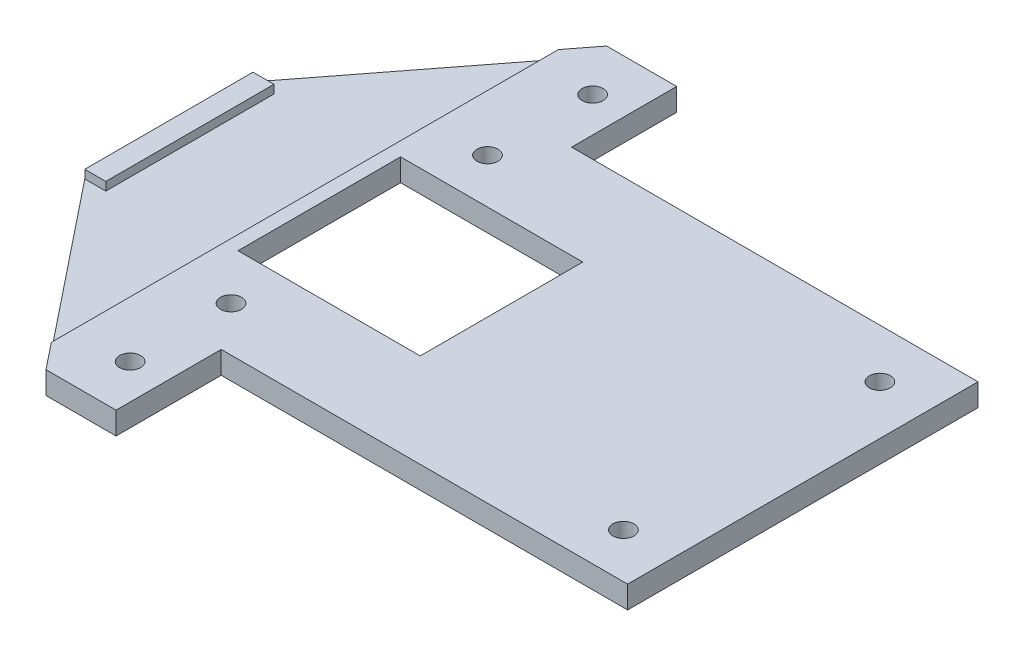
ISO-10303-21;
HEADER;
FILE_DESCRIPTION(('STEP AP214'),'2;1');
FILE_NAME('part.step','',(''),(''),'','','');
FILE_SCHEMA(('AUTOMOTIVE_DESIGN { 1 0 10303 214 1 1 1 1 }'));
ENDSEC;
DATA;
#1=APPLICATION_CONTEXT('core data for automotive mechanical design processes');
#2=APPLICATION_PROTOCOL_DEFINITION('international standard','automotive_design',2000,#1);
#3=PRODUCT_CONTEXT('',#1,'mechanical');
#4=PRODUCT('Part','Part','',(#3));
#5=PRODUCT_RELATED_PRODUCT_CATEGORY('part','',(#4));
#6=PRODUCT_DEFINITION_FORMATION('','',#4);
#7=PRODUCT_DEFINITION_CONTEXT('part definition',#1,'design');
#8=PRODUCT_DEFINITION('design','',#6,#7);
#9=PRODUCT_DEFINITION_SHAPE('','',#8);
#10=(LENGTH_UNIT() NAMED_UNIT(*) SI_UNIT(.MILLI.,.METRE.));
#11=(NAMED_UNIT(*) PLANE_ANGLE_UNIT() SI_UNIT($,.RADIAN.));
#12=(NAMED_UNIT(*) SI_UNIT($,.STERADIAN.) SOLID_ANGLE_UNIT());
#13=UNCERTAINTY_MEASURE_WITH_UNIT(LENGTH_MEASURE(1.E-05),#10,'distance_accuracy_value','');
#14=(GEOMETRIC_REPRESENTATION_CONTEXT(3) GLOBAL_UNCERTAINTY_ASSIGNED_CONTEXT((#13)) GLOBAL_UNIT_ASSIGNED_CONTEXT((#10,
#11,#12)) REPRESENTATION_CONTEXT('',''));
#15=CARTESIAN_POINT('',(0.,0.,0.));
#16=DIRECTION('',(0.,0.,1.));
#17=DIRECTION('',(1.,0.,0.));
#18=AXIS2_PLACEMENT_3D('',#15,#16,#17);
#19=CARTESIAN_POINT('',(11.,11.6,20.));
#20=DIRECTION('',(0.,0.,-1.));
#21=DIRECTION('',(-1.,0.,0.));
#22=AXIS2_PLACEMENT_3D('',#19,#20,#21);
#23=PLANE('',#22);
#24=DIRECTION('',(1.,0.,0.));
#25=VECTOR('',#24,1.);
#26=CARTESIAN_POINT('',(11.,1.6,20.));
#27=LINE('',#26,#25);
#28=CARTESIAN_POINT('',(11.,1.6,20.));
#29=VERTEX_POINT('',#28);
#30=CARTESIAN_POINT('',(16.,1.6,20.));
#31=VERTEX_POINT('',#30);
#32=EDGE_CURVE('E213',#29,#31,#27,.T.);
#33=ORIENTED_EDGE('',*,*,#32,.F.);
#34=DIRECTION('',(0.,-1.,0.));
#35=VECTOR('',#34,1.);
#36=CARTESIAN_POINT('',(11.,11.6,20.));
#37=LINE('',#36,#35);
#38=CARTESIAN_POINT('',(11.,0.,20.));
#39=VERTEX_POINT('',#38);
#40=EDGE_CURVE('E11',#29,#39,#37,.T.);
#41=ORIENTED_EDGE('',*,*,#40,.T.);
#42=DIRECTION('',(1.,0.,0.));
#43=VECTOR('',#42,1.);
#44=CARTESIAN_POINT('',(11.,0.,20.));
#45=LINE('',#44,#43);
#46=CARTESIAN_POINT('',(16.,0.,20.));
#47=VERTEX_POINT('',#46);
#48=EDGE_CURVE('E326',#39,#47,#45,.T.);
#49=ORIENTED_EDGE('',*,*,#48,.T.);
#50=DIRECTION('',(0.,-1.,0.));
#51=VECTOR('',#50,1.);
#52=CARTESIAN_POINT('',(16.,11.6,20.));
#53=LINE('',#52,#51);
#54=EDGE_CURVE('E294',#31,#47,#53,.T.);
#55=ORIENTED_EDGE('',*,*,#54,.F.);
#56=EDGE_LOOP('',(#33,#41,#49,#55));
#57=FACE_BOUND('',#56,.T.);
#58=ADVANCED_FACE('F34',(#57),#23,.F.);
#59=CARTESIAN_POINT('',(45.,11.6,20.));
#60=DIRECTION('',(-1.,0.,0.));
#61=DIRECTION('',(0.,0.,1.));
#62=AXIS2_PLACEMENT_3D('',#59,#60,#61);
#63=PLANE('',#62);
#64=DIRECTION('',(0.,0.,-1.));
#65=VECTOR('',#64,1.);
#66=CARTESIAN_POINT('',(45.,1.6,12.5));
#67=LINE('',#66,#65);
#68=CARTESIAN_POINT('',(45.,1.6,12.5));
#69=VERTEX_POINT('',#68);
#70=CARTESIAN_POINT('',(45.,1.6,-12.5));
#71=VERTEX_POINT('',#70);
#72=EDGE_CURVE('E58',#69,#71,#67,.T.);
#73=ORIENTED_EDGE('',*,*,#72,.F.);
#74=DIRECTION('',(0.,-1.,0.));
#75=VECTOR('',#74,1.);
#76=CARTESIAN_POINT('',(45.,11.6,12.5));
#77=LINE('',#76,#75);
#78=CARTESIAN_POINT('',(45.,0.,12.5));
#79=VERTEX_POINT('',#78);
#80=EDGE_CURVE('E297',#69,#79,#77,.T.);
#81=ORIENTED_EDGE('',*,*,#80,.T.);
#82=DIRECTION('',(0.,0.,-1.));
#83=VECTOR('',#82,1.);
#84=CARTESIAN_POINT('',(45.,0.,20.));
#85=LINE('',#84,#83);
#86=CARTESIAN_POINT('',(45.,0.,-12.5));
#87=VERTEX_POINT('',#86);
#88=EDGE_CURVE('E329',#79,#87,#85,.T.);
#89=ORIENTED_EDGE('',*,*,#88,.T.);
#90=DIRECTION('',(0.,-1.,0.));
#91=VECTOR('',#90,1.);
#92=CARTESIAN_POINT('',(45.,11.6,-12.5));
#93=LINE('',#92,#91);
#94=EDGE_CURVE('E285',#71,#87,#93,.T.);
#95=ORIENTED_EDGE('',*,*,#94,.F.);
#96=EDGE_LOOP('',(#73,#81,#89,#95));
#97=FACE_BOUND('',#96,.T.);
#98=ADVANCED_FACE('F383',(#97),#63,.F.);
#99=CARTESIAN_POINT('',(45.,11.6,-20.));
#100=DIRECTION('',(0.,0.,1.));
#101=DIRECTION('',(1.,0.,0.));
#102=AXIS2_PLACEMENT_3D('',#99,#100,#101);
#103=PLANE('',#102);
#104=DIRECTION('',(-1.,0.,0.));
#105=VECTOR('',#104,1.);
#106=CARTESIAN_POINT('',(16.,1.6,-20.));
#107=LINE('',#106,#105);
#108=CARTESIAN_POINT('',(16.,1.6,-20.));
#109=VERTEX_POINT('',#108);
#110=CARTESIAN_POINT('',(11.,1.6,-20.));
#111=VERTEX_POINT('',#110);
#112=EDGE_CURVE('E224',#109,#111,#107,.T.);
#113=ORIENTED_EDGE('',*,*,#112,.F.);
#114=DIRECTION('',(0.,-1.,0.));
#115=VECTOR('',#114,1.);
#116=CARTESIAN_POINT('',(16.,11.6,-20.));
#117=LINE('',#116,#115);
#118=CARTESIAN_POINT('',(16.,0.,-20.));
#119=VERTEX_POINT('',#118);
#120=EDGE_CURVE('E281',#109,#119,#117,.T.);
#121=ORIENTED_EDGE('',*,*,#120,.T.);
#122=DIRECTION('',(-1.,0.,0.));
#123=VECTOR('',#122,1.);
#124=CARTESIAN_POINT('',(45.,0.,-20.));
#125=LINE('',#124,#123);
#126=CARTESIAN_POINT('',(11.,0.,-20.));
#127=VERTEX_POINT('',#126);
#128=EDGE_CURVE('E332',#119,#127,#125,.T.);
#129=ORIENTED_EDGE('',*,*,#128,.T.);
#130=DIRECTION('',(0.,-1.,0.));
#131=VECTOR('',#130,1.);
#132=CARTESIAN_POINT('',(11.,11.6,-20.));
#133=LINE('',#132,#131);
#134=EDGE_CURVE('E43',#111,#127,#133,.T.);
#135=ORIENTED_EDGE('',*,*,#134,.F.);
#136=EDGE_LOOP('',(#113,#121,#129,#135));
#137=FACE_BOUND('',#136,.T.);
#138=ADVANCED_FACE('F357',(#137),#103,.F.);
#139=CARTESIAN_POINT('',(10.5,0.,-5.8));
#140=DIRECTION('',(-1.,0.,0.));
#141=DIRECTION('',(0.,0.,1.));
#142=AXIS2_PLACEMENT_3D('',#139,#140,#141);
#143=PLANE('',#142);
#144=DIRECTION('',(0.,0.,-1.));
#145=VECTOR('',#144,1.);
#146=CARTESIAN_POINT('',(10.5,1.6,-5.8));
#147=LINE('',#146,#145);
#148=CARTESIAN_POINT('',(10.5,1.6,5.8));
#149=VERTEX_POINT('',#148);
#150=CARTESIAN_POINT('',(10.5,1.6,-5.8));
#151=VERTEX_POINT('',#150);
#152=EDGE_CURVE('E246',#149,#151,#147,.T.);
#153=ORIENTED_EDGE('',*,*,#152,.F.);
#154=DIRECTION('',(0.,1.,0.));
#155=VECTOR('',#154,1.);
#156=CARTESIAN_POINT('',(10.5,0.,5.8));
#157=LINE('',#156,#155);
#158=CARTESIAN_POINT('',(10.5,0.,5.8));
#159=VERTEX_POINT('',#158);
#160=EDGE_CURVE('E311',#159,#149,#157,.T.);
#161=ORIENTED_EDGE('',*,*,#160,.F.);
#162=DIRECTION('',(0.,0.,1.));
#163=VECTOR('',#162,1.);
#164=CARTESIAN_POINT('',(10.5,0.,-5.8));
#165=LINE('',#164,#163);
#166=CARTESIAN_POINT('',(10.5,0.,-5.8));
#167=VERTEX_POINT('',#166);
#168=EDGE_CURVE('E296',#167,#159,#165,.T.);
#169=ORIENTED_EDGE('',*,*,#168,.F.);
#170=DIRECTION('',(0.,1.,0.));
#171=VECTOR('',#170,1.);
#172=CARTESIAN_POINT('',(10.5,0.,-5.8));
#173=LINE('',#172,#171);
#174=EDGE_CURVE('E312',#167,#151,#173,.T.);
#175=ORIENTED_EDGE('',*,*,#174,.T.);
#176=EDGE_LOOP('',(#153,#161,#169,#175));
#177=FACE_BOUND('',#176,.T.);
#178=ADVANCED_FACE('F421',(#177),#143,.F.);
#179=CARTESIAN_POINT('',(10.5,0.,-5.8));
#180=DIRECTION('',(0.,0.,-1.));
#181=DIRECTION('',(-1.,0.,0.));
#182=AXIS2_PLACEMENT_3D('',#179,#180,#181);
#183=PLANE('',#182);
#184=DIRECTION('',(1.,0.,0.));
#185=VECTOR('',#184,1.);
#186=CARTESIAN_POINT('',(10.5,1.6,-5.8));
#187=LINE('',#186,#185);
#188=CARTESIAN_POINT('',(23.5,1.6,-5.8));
#189=VERTEX_POINT('',#188);
#190=EDGE_CURVE('E244',#151,#189,#187,.T.);
#191=ORIENTED_EDGE('',*,*,#190,.F.);
#192=ORIENTED_EDGE('',*,*,#174,.F.);
#193=DIRECTION('',(-1.,0.,0.));
#194=VECTOR('',#193,1.);
#195=CARTESIAN_POINT('',(10.5,0.,-5.8));
#196=LINE('',#195,#194);
#197=CARTESIAN_POINT('',(23.5,0.,-5.8));
#198=VERTEX_POINT('',#197);
#199=EDGE_CURVE('E308',#198,#167,#196,.T.);
#200=ORIENTED_EDGE('',*,*,#199,.F.);
#201=DIRECTION('',(0.,1.,0.));
#202=VECTOR('',#201,1.);
#203=CARTESIAN_POINT('',(23.5,0.,-5.8));
#204=LINE('',#203,#202);
#205=EDGE_CURVE('E316',#198,#189,#204,.T.);
#206=ORIENTED_EDGE('',*,*,#205,.T.);
#207=EDGE_LOOP('',(#191,#192,#200,#206));
#208=FACE_BOUND('',#207,.T.);
#209=ADVANCED_FACE('F429',(#208),#183,.F.);
#210=CARTESIAN_POINT('',(23.5,0.,-5.8));
#211=DIRECTION('',(1.,0.,0.));
#212=DIRECTION('',(0.,0.,-1.));
#213=AXIS2_PLACEMENT_3D('',#210,#211,#212);
#214=PLANE('',#213);
#215=DIRECTION('',(0.,0.,1.));
#216=VECTOR('',#215,1.);
#217=CARTESIAN_POINT('',(23.5,1.6,-5.8));
#218=LINE('',#217,#216);
#219=CARTESIAN_POINT('',(23.5,1.6,5.8));
#220=VERTEX_POINT('',#219);
#221=EDGE_CURVE('E50',#189,#220,#218,.T.);
#222=ORIENTED_EDGE('',*,*,#221,.F.);
#223=ORIENTED_EDGE('',*,*,#205,.F.);
#224=DIRECTION('',(0.,0.,-1.));
#225=VECTOR('',#224,1.);
#226=CARTESIAN_POINT('',(23.5,0.,-5.8));
#227=LINE('',#226,#225);
#228=CARTESIAN_POINT('',(23.5,0.,5.8));
#229=VERTEX_POINT('',#228);
#230=EDGE_CURVE('E305',#229,#198,#227,.T.);
#231=ORIENTED_EDGE('',*,*,#230,.F.);
#232=DIRECTION('',(0.,1.,0.));
#233=VECTOR('',#232,1.);
#234=CARTESIAN_POINT('',(23.5,0.,5.8));
#235=LINE('',#234,#233);
#236=EDGE_CURVE('E319',#229,#220,#235,.T.);
#237=ORIENTED_EDGE('',*,*,#236,.T.);
#238=EDGE_LOOP('',(#222,#223,#231,#237));
#239=FACE_BOUND('',#238,.T.);
#240=ADVANCED_FACE('F435',(#239),#214,.F.);
#241=CARTESIAN_POINT('',(10.5,0.,5.8));
#242=DIRECTION('',(0.,0.,1.));
#243=DIRECTION('',(1.,0.,0.));
#244=AXIS2_PLACEMENT_3D('',#241,#242,#243);
#245=PLANE('',#244);
#246=DIRECTION('',(-1.,0.,0.));
#247=VECTOR('',#246,1.);
#248=CARTESIAN_POINT('',(10.5,1.6,5.8));
#249=LINE('',#248,#247);
#250=EDGE_CURVE('E241',#220,#149,#249,.T.);
#251=ORIENTED_EDGE('',*,*,#250,.F.);
#252=ORIENTED_EDGE('',*,*,#236,.F.);
#253=DIRECTION('',(1.,0.,0.));
#254=VECTOR('',#253,1.);
#255=CARTESIAN_POINT('',(10.5,0.,5.8));
#256=LINE('',#255,#254);
#257=EDGE_CURVE('E302',#159,#229,#256,.T.);
#258=ORIENTED_EDGE('',*,*,#257,.F.);
#259=ORIENTED_EDGE('',*,*,#160,.T.);
#260=EDGE_LOOP('',(#251,#252,#258,#259));
#261=FACE_BOUND('',#260,.T.);
#262=ADVANCED_FACE('F431',(#261),#245,.F.);
#263=CARTESIAN_POINT('',(16.,11.6,20.));
#264=DIRECTION('',(-1.,0.,0.));
#265=DIRECTION('',(0.,0.,1.));
#266=AXIS2_PLACEMENT_3D('',#263,#264,#265);
#267=PLANE('',#266);
#268=DIRECTION('',(0.,0.,-1.));
#269=VECTOR('',#268,1.);
#270=CARTESIAN_POINT('',(16.,1.6,20.));
#271=LINE('',#270,#269);
#272=CARTESIAN_POINT('',(16.,1.6,12.5));
#273=VERTEX_POINT('',#272);
#274=EDGE_CURVE('E215',#31,#273,#271,.T.);
#275=ORIENTED_EDGE('',*,*,#274,.F.);
#276=ORIENTED_EDGE('',*,*,#54,.T.);
#277=DIRECTION('',(0.,0.,-1.));
#278=VECTOR('',#277,1.);
#279=CARTESIAN_POINT('',(16.,0.,20.));
#280=LINE('',#279,#278);
#281=CARTESIAN_POINT('',(16.,0.,12.5));
#282=VERTEX_POINT('',#281);
#283=EDGE_CURVE('E284',#47,#282,#280,.T.);
#284=ORIENTED_EDGE('',*,*,#283,.T.);
#285=DIRECTION('',(0.,-1.,0.));
#286=VECTOR('',#285,1.);
#287=CARTESIAN_POINT('',(16.,11.6,12.5));
#288=LINE('',#287,#286);
#289=EDGE_CURVE('E293',#273,#282,#288,.T.);
#290=ORIENTED_EDGE('',*,*,#289,.F.);
#291=EDGE_LOOP('',(#275,#276,#284,#290));
#292=FACE_BOUND('',#291,.T.);
#293=ADVANCED_FACE('F434',(#292),#267,.F.);
#294=CARTESIAN_POINT('',(16.,11.6,12.5));
#295=DIRECTION('',(0.,0.,-1.));
#296=DIRECTION('',(-1.,0.,0.));
#297=AXIS2_PLACEMENT_3D('',#294,#295,#296);
#298=PLANE('',#297);
#299=DIRECTION('',(1.,0.,0.));
#300=VECTOR('',#299,1.);
#301=CARTESIAN_POINT('',(16.,1.6,12.5));
#302=LINE('',#301,#300);
#303=EDGE_CURVE('E217',#273,#69,#302,.T.);
#304=ORIENTED_EDGE('',*,*,#303,.F.);
#305=ORIENTED_EDGE('',*,*,#289,.T.);
#306=DIRECTION('',(1.,0.,0.));
#307=VECTOR('',#306,1.);
#308=CARTESIAN_POINT('',(16.,0.,12.5));
#309=LINE('',#308,#307);
#310=EDGE_CURVE('E290',#282,#79,#309,.T.);
#311=ORIENTED_EDGE('',*,*,#310,.T.);
#312=ORIENTED_EDGE('',*,*,#80,.F.);
#313=EDGE_LOOP('',(#304,#305,#311,#312));
#314=FACE_BOUND('',#313,.T.);
#315=ADVANCED_FACE('F387',(#314),#298,.F.);
#316=CARTESIAN_POINT('',(16.,11.6,-20.));
#317=DIRECTION('',(-1.,0.,0.));
#318=DIRECTION('',(0.,0.,1.));
#319=AXIS2_PLACEMENT_3D('',#316,#317,#318);
#320=PLANE('',#319);
#321=DIRECTION('',(0.,0.,-1.));
#322=VECTOR('',#321,1.);
#323=CARTESIAN_POINT('',(16.,1.6,-12.5));
#324=LINE('',#323,#322);
#325=CARTESIAN_POINT('',(16.,1.6,-12.5));
#326=VERTEX_POINT('',#325);
#327=EDGE_CURVE('E222',#326,#109,#324,.T.);
#328=ORIENTED_EDGE('',*,*,#327,.F.);
#329=DIRECTION('',(0.,-1.,0.));
#330=VECTOR('',#329,1.);
#331=CARTESIAN_POINT('',(16.,11.6,-12.5));
#332=LINE('',#331,#330);
#333=CARTESIAN_POINT('',(16.,0.,-12.5));
#334=VERTEX_POINT('',#333);
#335=EDGE_CURVE('E282',#326,#334,#332,.T.);
#336=ORIENTED_EDGE('',*,*,#335,.T.);
#337=DIRECTION('',(0.,0.,-1.));
#338=VECTOR('',#337,1.);
#339=CARTESIAN_POINT('',(16.,0.,-20.));
#340=LINE('',#339,#338);
#341=EDGE_CURVE('E275',#334,#119,#340,.T.);
#342=ORIENTED_EDGE('',*,*,#341,.T.);
#343=ORIENTED_EDGE('',*,*,#120,.F.);
#344=EDGE_LOOP('',(#328,#336,#342,#343));
#345=FACE_BOUND('',#344,.T.);
#346=ADVANCED_FACE('F375',(#345),#320,.F.);
#347=CARTESIAN_POINT('',(16.,11.6,-12.5));
#348=DIRECTION('',(0.,0.,1.));
#349=DIRECTION('',(1.,0.,0.));
#350=AXIS2_PLACEMENT_3D('',#347,#348,#349);
#351=PLANE('',#350);
#352=DIRECTION('',(-1.,0.,0.));
#353=VECTOR('',#352,1.);
#354=CARTESIAN_POINT('',(45.,1.6,-12.5));
#355=LINE('',#354,#353);
#356=EDGE_CURVE('E220',#71,#326,#355,.T.);
#357=ORIENTED_EDGE('',*,*,#356,.F.);
#358=ORIENTED_EDGE('',*,*,#94,.T.);
#359=DIRECTION('',(-1.,0.,0.));
#360=VECTOR('',#359,1.);
#361=CARTESIAN_POINT('',(16.,0.,-12.5));
#362=LINE('',#361,#360);
#363=EDGE_CURVE('E278',#87,#334,#362,.T.);
#364=ORIENTED_EDGE('',*,*,#363,.T.);
#365=ORIENTED_EDGE('',*,*,#335,.F.);
#366=EDGE_LOOP('',(#357,#358,#364,#365));
#367=FACE_BOUND('',#366,.T.);
#368=ADVANCED_FACE('F449',(#367),#351,.F.);
#369=CARTESIAN_POINT('',(13.5,0.,-16.5));
#370=DIRECTION('',(0.,1.,0.));
#371=DIRECTION('',(0.,0.,1.));
#372=AXIS2_PLACEMENT_3D('',#369,#370,#371);
#373=CYLINDRICAL_SURFACE('',#372,0.75);
#374=CARTESIAN_POINT('',(13.5,0.,-16.5));
#375=DIRECTION('',(0.,1.,0.));
#376=DIRECTION('',(0.,0.,1.));
#377=AXIS2_PLACEMENT_3D('',#374,#375,#376);
#378=CIRCLE('',#377,0.75);
#379=CARTESIAN_POINT('',(13.5,0.,-15.75));
#380=VERTEX_POINT('',#379);
#381=EDGE_CURVE('E261',#380,#380,#378,.T.);
#382=ORIENTED_EDGE('',*,*,#381,.F.);
#383=EDGE_LOOP('',(#382));
#384=FACE_BOUND('',#383,.T.);
#385=CARTESIAN_POINT('',(13.5,1.6,-16.5));
#386=DIRECTION('',(0.,1.,0.));
#387=DIRECTION('',(0.,0.,1.));
#388=AXIS2_PLACEMENT_3D('',#385,#386,#387);
#389=CIRCLE('',#388,0.75);
#390=CARTESIAN_POINT('',(13.5,1.6,-15.75));
#391=VERTEX_POINT('',#390);
#392=EDGE_CURVE('E238',#391,#391,#389,.F.);
#393=ORIENTED_EDGE('',*,*,#392,.F.);
#394=EDGE_LOOP('',(#393));
#395=FACE_BOUND('',#394,.T.);
#396=ADVANCED_FACE('F452',(#384,#395),#373,.F.);
#397=CARTESIAN_POINT('',(13.5,0.,16.5));
#398=DIRECTION('',(0.,1.,0.));
#399=DIRECTION('',(0.,0.,1.));
#400=AXIS2_PLACEMENT_3D('',#397,#398,#399);
#401=CYLINDRICAL_SURFACE('',#400,0.75);
#402=CARTESIAN_POINT('',(13.5,0.,16.5));
#403=DIRECTION('',(0.,1.,0.));
#404=DIRECTION('',(0.,0.,1.));
#405=AXIS2_PLACEMENT_3D('',#402,#403,#404);
#406=CIRCLE('',#405,0.75);
#407=CARTESIAN_POINT('',(13.5,0.,17.25));
#408=VERTEX_POINT('',#407);
#409=EDGE_CURVE('E257',#408,#408,#406,.T.);
#410=ORIENTED_EDGE('',*,*,#409,.F.);
#411=EDGE_LOOP('',(#410));
#412=FACE_BOUND('',#411,.T.);
#413=CARTESIAN_POINT('',(13.5,1.6,16.5));
#414=DIRECTION('',(0.,1.,0.));
#415=DIRECTION('',(0.,0.,1.));
#416=AXIS2_PLACEMENT_3D('',#413,#414,#415);
#417=CIRCLE('',#416,0.75);
#418=CARTESIAN_POINT('',(13.5,1.6,17.25));
#419=VERTEX_POINT('',#418);
#420=EDGE_CURVE('E235',#419,#419,#417,.F.);
#421=ORIENTED_EDGE('',*,*,#420,.F.);
#422=EDGE_LOOP('',(#421));
#423=FACE_BOUND('',#422,.T.);
#424=ADVANCED_FACE('F455',(#412,#423),#401,.F.);
#425=CARTESIAN_POINT('',(13.5,0.,9.3));
#426=DIRECTION('',(0.,1.,0.));
#427=DIRECTION('',(0.,0.,1.));
#428=AXIS2_PLACEMENT_3D('',#425,#426,#427);
#429=CYLINDRICAL_SURFACE('',#428,0.75);
#430=CARTESIAN_POINT('',(13.5,0.,9.3));
#431=DIRECTION('',(0.,1.,0.));
#432=DIRECTION('',(0.,0.,1.));
#433=AXIS2_PLACEMENT_3D('',#430,#431,#432);
#434=CIRCLE('',#433,0.75);
#435=CARTESIAN_POINT('',(13.5,0.,10.05));
#436=VERTEX_POINT('',#435);
#437=EDGE_CURVE('E268',#436,#436,#434,.T.);
#438=ORIENTED_EDGE('',*,*,#437,.F.);
#439=EDGE_LOOP('',(#438));
#440=FACE_BOUND('',#439,.T.);
#441=CARTESIAN_POINT('',(13.5,1.6,9.3));
#442=DIRECTION('',(0.,1.,0.));
#443=DIRECTION('',(0.,0.,1.));
#444=AXIS2_PLACEMENT_3D('',#441,#442,#443);
#445=CIRCLE('',#444,0.75);
#446=CARTESIAN_POINT('',(13.5,1.6,10.05));
#447=VERTEX_POINT('',#446);
#448=EDGE_CURVE('E232',#447,#447,#445,.F.);
#449=ORIENTED_EDGE('',*,*,#448,.F.);
#450=EDGE_LOOP('',(#449));
#451=FACE_BOUND('',#450,.T.);
#452=ADVANCED_FACE('F459',(#440,#451),#429,.F.);
#453=CARTESIAN_POINT('',(41.5,0.,9.3));
#454=DIRECTION('',(0.,1.,0.));
#455=DIRECTION('',(0.,0.,1.));
#456=AXIS2_PLACEMENT_3D('',#453,#454,#455);
#457=CYLINDRICAL_SURFACE('',#456,0.749999999999999);
#458=CARTESIAN_POINT('',(41.5,0.,9.3));
#459=DIRECTION('',(0.,1.,0.));
#460=DIRECTION('',(0.,0.,1.));
#461=AXIS2_PLACEMENT_3D('',#458,#459,#460);
#462=CIRCLE('',#461,0.749999999999999);
#463=CARTESIAN_POINT('',(41.5,0.,10.05));
#464=VERTEX_POINT('',#463);
#465=EDGE_CURVE('E265',#464,#464,#462,.T.);
#466=ORIENTED_EDGE('',*,*,#465,.F.);
#467=EDGE_LOOP('',(#466));
#468=FACE_BOUND('',#467,.T.);
#469=CARTESIAN_POINT('',(41.5,1.6,9.3));
#470=DIRECTION('',(0.,1.,0.));
#471=DIRECTION('',(0.,0.,1.));
#472=AXIS2_PLACEMENT_3D('',#469,#470,#471);
#473=CIRCLE('',#472,0.749999999999999);
#474=CARTESIAN_POINT('',(41.5,1.6,10.05));
#475=VERTEX_POINT('',#474);
#476=EDGE_CURVE('E229',#475,#475,#473,.F.);
#477=ORIENTED_EDGE('',*,*,#476,.F.);
#478=EDGE_LOOP('',(#477));
#479=FACE_BOUND('',#478,.T.);
#480=ADVANCED_FACE('F463',(#468,#479),#457,.F.);
#481=CARTESIAN_POINT('',(41.5,0.,-9.));
#482=DIRECTION('',(0.,1.,0.));
#483=DIRECTION('',(0.,0.,1.));
#484=AXIS2_PLACEMENT_3D('',#481,#482,#483);
#485=CYLINDRICAL_SURFACE('',#484,0.749999999999999);
#486=CARTESIAN_POINT('',(41.5,0.,-9.));
#487=DIRECTION('',(0.,1.,0.));
#488=DIRECTION('',(0.,0.,1.));
#489=AXIS2_PLACEMENT_3D('',#486,#487,#488);
#490=CIRCLE('',#489,0.749999999999999);
#491=CARTESIAN_POINT('',(41.5,0.,-8.25));
#492=VERTEX_POINT('',#491);
#493=EDGE_CURVE('E262',#492,#492,#490,.T.);
#494=ORIENTED_EDGE('',*,*,#493,.F.);
#495=EDGE_LOOP('',(#494));
#496=FACE_BOUND('',#495,.T.);
#497=CARTESIAN_POINT('',(41.5,1.6,-9.));
#498=DIRECTION('',(0.,1.,0.));
#499=DIRECTION('',(0.,0.,1.));
#500=AXIS2_PLACEMENT_3D('',#497,#498,#499);
#501=CIRCLE('',#500,0.749999999999999);
#502=CARTESIAN_POINT('',(41.5,1.6,-8.25));
#503=VERTEX_POINT('',#502);
#504=EDGE_CURVE('E226',#503,#503,#501,.F.);
#505=ORIENTED_EDGE('',*,*,#504,.F.);
#506=EDGE_LOOP('',(#505));
#507=FACE_BOUND('',#506,.T.);
#508=ADVANCED_FACE('F467',(#496,#507),#485,.F.);
#509=CARTESIAN_POINT('',(13.5,0.,-9.));
#510=DIRECTION('',(0.,1.,0.));
#511=DIRECTION('',(0.,0.,1.));
#512=AXIS2_PLACEMENT_3D('',#509,#510,#511);
#513=CYLINDRICAL_SURFACE('',#512,0.75);
#514=CARTESIAN_POINT('',(13.5,0.,-9.));
#515=DIRECTION('',(0.,1.,0.));
#516=DIRECTION('',(0.,0.,1.));
#517=AXIS2_PLACEMENT_3D('',#514,#515,#516);
#518=CIRCLE('',#517,0.75);
#519=CARTESIAN_POINT('',(13.5,0.,-8.25));
#520=VERTEX_POINT('',#519);
#521=EDGE_CURVE('E258',#520,#520,#518,.T.);
#522=ORIENTED_EDGE('',*,*,#521,.F.);
#523=EDGE_LOOP('',(#522));
#524=FACE_BOUND('',#523,.T.);
#525=CARTESIAN_POINT('',(13.5,1.6,-9.));
#526=DIRECTION('',(0.,1.,0.));
#527=DIRECTION('',(0.,0.,1.));
#528=AXIS2_PLACEMENT_3D('',#525,#526,#527);
#529=CIRCLE('',#528,0.75);
#530=CARTESIAN_POINT('',(13.5,1.6,-8.25));
#531=VERTEX_POINT('',#530);
#532=EDGE_CURVE('E38',#531,#531,#529,.F.);
#533=ORIENTED_EDGE('',*,*,#532,.F.);
#534=EDGE_LOOP('',(#533));
#535=FACE_BOUND('',#534,.T.);
#536=ADVANCED_FACE('F425',(#524,#535),#513,.F.);
#537=CARTESIAN_POINT('',(0.,11.6,-5.76701828329514));
#538=DIRECTION('',(1.,0.,0.));
#539=DIRECTION('',(0.,0.,-1.));
#540=AXIS2_PLACEMENT_3D('',#537,#538,#539);
#541=PLANE('',#540);
#542=DIRECTION('',(0.,0.,1.));
#543=VECTOR('',#542,1.);
#544=CARTESIAN_POINT('',(0.,1.6,-5.76701828329514));
#545=LINE('',#544,#543);
#546=CARTESIAN_POINT('',(0.,1.6,-5.76701828329514));
#547=VERTEX_POINT('',#546);
#548=CARTESIAN_POINT('',(0.,1.6,6.23298171670485));
#549=VERTEX_POINT('',#548);
#550=EDGE_CURVE('E248',#547,#549,#545,.T.);
#551=ORIENTED_EDGE('',*,*,#550,.F.);
#552=DIRECTION('',(0.,-1.,0.));
#553=VECTOR('',#552,1.);
#554=CARTESIAN_POINT('',(0.,11.6,-5.76701828329514));
#555=LINE('',#554,#553);
#556=CARTESIAN_POINT('',(0.,1.,-5.76701828329514));
#557=VERTEX_POINT('',#556);
#558=EDGE_CURVE('E345',#547,#557,#555,.T.);
#559=ORIENTED_EDGE('',*,*,#558,.T.);
#560=CARTESIAN_POINT('',(0.,0.,-5.76701828329514));
#561=VERTEX_POINT('',#560);
#562=EDGE_CURVE('E344',#557,#561,#555,.T.);
#563=ORIENTED_EDGE('',*,*,#562,.T.);
#564=DIRECTION('',(0.,0.,1.));
#565=VECTOR('',#564,1.);
#566=CARTESIAN_POINT('',(0.,0.,-5.76701828329514));
#567=LINE('',#566,#565);
#568=CARTESIAN_POINT('',(0.,0.,6.23298171670485));
#569=VERTEX_POINT('',#568);
#570=EDGE_CURVE('E338',#561,#569,#567,.T.);
#571=ORIENTED_EDGE('',*,*,#570,.T.);
#572=DIRECTION('',(0.,-1.,0.));
#573=VECTOR('',#572,1.);
#574=CARTESIAN_POINT('',(0.,11.6,6.23298171670485));
#575=LINE('',#574,#573);
#576=CARTESIAN_POINT('',(0.,1.,6.23298171670485));
#577=VERTEX_POINT('',#576);
#578=EDGE_CURVE('E341',#577,#569,#575,.T.);
#579=ORIENTED_EDGE('',*,*,#578,.F.);
#580=EDGE_CURVE('E342',#549,#577,#575,.T.);
#581=ORIENTED_EDGE('',*,*,#580,.F.);
#582=EDGE_LOOP('',(#551,#559,#563,#571,#579,#581));
#583=FACE_BOUND('',#582,.T.);
#584=ADVANCED_FACE('F368',(#583),#541,.F.);
#585=CARTESIAN_POINT('',(0.,11.6,6.23298171670485));
#586=DIRECTION('',(0.781245544254896,0.,-0.624223837723193));
#587=DIRECTION('',(-0.624223837723193,0.,-0.781245544254896));
#588=AXIS2_PLACEMENT_3D('',#585,#586,#587);
#589=PLANE('',#588);
#590=DIRECTION('',(0.624223837723193,0.,0.781245544254896));
#591=VECTOR('',#590,1.);
#592=CARTESIAN_POINT('',(9.5,1.6,18.1226793250052));
#593=LINE('',#592,#591);
#594=CARTESIAN_POINT('',(9.5,1.6,18.1226793250052));
#595=VERTEX_POINT('',#594);
#596=EDGE_CURVE('E211',#595,#29,#593,.T.);
#597=ORIENTED_EDGE('',*,*,#596,.F.);
#598=DIRECTION('',(0.,1.,0.));
#599=VECTOR('',#598,1.);
#600=CARTESIAN_POINT('',(9.5,1.,18.1226793250052));
#601=LINE('',#600,#599);
#602=CARTESIAN_POINT('',(9.5,1.,18.1226793250052));
#603=VERTEX_POINT('',#602);
#604=EDGE_CURVE('E203',#603,#595,#601,.T.);
#605=ORIENTED_EDGE('',*,*,#604,.F.);
#606=DIRECTION('',(0.624223837723193,0.,0.781245544254896));
#607=VECTOR('',#606,1.);
#608=CARTESIAN_POINT('',(9.5,1.,18.1226793250052));
#609=LINE('',#608,#607);
#610=EDGE_CURVE('E193',#577,#603,#609,.T.);
#611=ORIENTED_EDGE('',*,*,#610,.F.);
#612=ORIENTED_EDGE('',*,*,#578,.T.);
#613=DIRECTION('',(0.624223837723193,0.,0.781245544254896));
#614=VECTOR('',#613,1.);
#615=CARTESIAN_POINT('',(0.,0.,6.23298171670485));
#616=LINE('',#615,#614);
#617=EDGE_CURVE('E315',#569,#39,#616,.T.);
#618=ORIENTED_EDGE('',*,*,#617,.T.);
#619=ORIENTED_EDGE('',*,*,#40,.F.);
#620=EDGE_LOOP('',(#597,#605,#611,#612,#618,#619));
#621=FACE_BOUND('',#620,.T.);
#622=ADVANCED_FACE('F36',(#621),#589,.F.);
#623=CARTESIAN_POINT('',(11.,11.6,-20.));
#624=DIRECTION('',(0.791236938020187,0.,0.611509695681466));
#625=DIRECTION('',(0.611509695681466,0.,-0.791236938020187));
#626=AXIS2_PLACEMENT_3D('',#623,#624,#625);
#627=PLANE('',#626);
#628=DIRECTION('',(-0.611509695681466,0.,0.791236938020187));
#629=VECTOR('',#628,1.);
#630=CARTESIAN_POINT('',(0.,1.,-5.76701828329514));
#631=LINE('',#630,#629);
#632=CARTESIAN_POINT('',(9.5,1.,-18.059138856813));
#633=VERTEX_POINT('',#632);
#634=EDGE_CURVE('E175',#633,#557,#631,.T.);
#635=ORIENTED_EDGE('',*,*,#634,.F.);
#636=DIRECTION('',(0.,1.,0.));
#637=VECTOR('',#636,1.);
#638=CARTESIAN_POINT('',(9.5,1.,-18.059138856813));
#639=LINE('',#638,#637);
#640=CARTESIAN_POINT('',(9.5,1.6,-18.059138856813));
#641=VERTEX_POINT('',#640);
#642=EDGE_CURVE('E199',#633,#641,#639,.T.);
#643=ORIENTED_EDGE('',*,*,#642,.T.);
#644=DIRECTION('',(-0.611509695681467,0.,0.791236938020186));
#645=VECTOR('',#644,1.);
#646=CARTESIAN_POINT('',(11.,1.6,-20.));
#647=LINE('',#646,#645);
#648=EDGE_CURVE('E202',#111,#641,#647,.T.);
#649=ORIENTED_EDGE('',*,*,#648,.F.);
#650=ORIENTED_EDGE('',*,*,#134,.T.);
#651=DIRECTION('',(-0.611509695681466,0.,0.791236938020187));
#652=VECTOR('',#651,1.);
#653=CARTESIAN_POINT('',(11.,0.,-20.));
#654=LINE('',#653,#652);
#655=EDGE_CURVE('E335',#127,#561,#654,.T.);
#656=ORIENTED_EDGE('',*,*,#655,.T.);
#657=ORIENTED_EDGE('',*,*,#562,.F.);
#658=EDGE_LOOP('',(#635,#643,#649,#650,#656,#657));
#659=FACE_BOUND('',#658,.T.);
#660=ADVANCED_FACE('F351',(#659),#627,.F.);
#661=CARTESIAN_POINT('',(0.,0.,0.));
#662=DIRECTION('',(0.,-1.,0.));
#663=DIRECTION('',(0.,0.,-1.));
#664=AXIS2_PLACEMENT_3D('',#661,#662,#663);
#665=PLANE('',#664);
#666=ORIENTED_EDGE('',*,*,#521,.T.);
#667=EDGE_LOOP('',(#666));
#668=FACE_BOUND('',#667,.T.);
#669=ORIENTED_EDGE('',*,*,#493,.T.);
#670=EDGE_LOOP('',(#669));
#671=FACE_BOUND('',#670,.T.);
#672=ORIENTED_EDGE('',*,*,#465,.T.);
#673=EDGE_LOOP('',(#672));
#674=FACE_BOUND('',#673,.T.);
#675=ORIENTED_EDGE('',*,*,#437,.T.);
#676=EDGE_LOOP('',(#675));
#677=FACE_BOUND('',#676,.T.);
#678=ORIENTED_EDGE('',*,*,#409,.T.);
#679=EDGE_LOOP('',(#678));
#680=FACE_BOUND('',#679,.T.);
#681=ORIENTED_EDGE('',*,*,#381,.T.);
#682=EDGE_LOOP('',(#681));
#683=FACE_BOUND('',#682,.T.);
#684=ORIENTED_EDGE('',*,*,#341,.F.);
#685=ORIENTED_EDGE('',*,*,#363,.F.);
#686=ORIENTED_EDGE('',*,*,#88,.F.);
#687=ORIENTED_EDGE('',*,*,#310,.F.);
#688=ORIENTED_EDGE('',*,*,#283,.F.);
#689=ORIENTED_EDGE('',*,*,#48,.F.);
#690=ORIENTED_EDGE('',*,*,#617,.F.);
#691=ORIENTED_EDGE('',*,*,#570,.F.);
#692=ORIENTED_EDGE('',*,*,#655,.F.);
#693=ORIENTED_EDGE('',*,*,#128,.F.);
#694=EDGE_LOOP('',(#684,#685,#686,#687,#688,#689,#690,#691,#692,#693));
#695=FACE_BOUND('',#694,.T.);
#696=ORIENTED_EDGE('',*,*,#168,.T.);
#697=ORIENTED_EDGE('',*,*,#257,.T.);
#698=ORIENTED_EDGE('',*,*,#230,.T.);
#699=ORIENTED_EDGE('',*,*,#199,.T.);
#700=EDGE_LOOP('',(#696,#697,#698,#699));
#701=FACE_BOUND('',#700,.T.);
#702=ADVANCED_FACE('F361',(#668,#671,#674,#677,#680,#683,#695,#701),#665,.T.);
#703=CARTESIAN_POINT('',(0.,1.6,0.));
#704=DIRECTION('',(0.,1.,0.));
#705=DIRECTION('',(0.,0.,1.));
#706=AXIS2_PLACEMENT_3D('',#703,#704,#705);
#707=PLANE('',#706);
#708=ORIENTED_EDGE('',*,*,#550,.T.);
#709=DIRECTION('',(1.,0.,0.));
#710=VECTOR('',#709,1.);
#711=CARTESIAN_POINT('',(0.,1.6,6.23298171670486));
#712=LINE('',#711,#710);
#713=CARTESIAN_POINT('',(1.5,1.6,6.23298171670486));
#714=VERTEX_POINT('',#713);
#715=EDGE_CURVE('E251',#549,#714,#712,.T.);
#716=ORIENTED_EDGE('',*,*,#715,.T.);
#717=DIRECTION('',(0.,0.,-1.));
#718=VECTOR('',#717,1.);
#719=CARTESIAN_POINT('',(1.5,1.6,-5.76701828329514));
#720=LINE('',#719,#718);
#721=CARTESIAN_POINT('',(1.5,1.6,-5.76701828329514));
#722=VERTEX_POINT('',#721);
#723=EDGE_CURVE('E254',#714,#722,#720,.T.);
#724=ORIENTED_EDGE('',*,*,#723,.T.);
#725=DIRECTION('',(-1.,0.,0.));
#726=VECTOR('',#725,1.);
#727=CARTESIAN_POINT('',(0.,1.6,-5.76701828329514));
#728=LINE('',#727,#726);
#729=EDGE_CURVE('E171',#722,#547,#728,.T.);
#730=ORIENTED_EDGE('',*,*,#729,.T.);
#731=EDGE_LOOP('',(#708,#716,#724,#730));
#732=FACE_BOUND('',#731,.T.);
#733=ADVANCED_FACE('F401',(#732),#707,.T.);
#734=CARTESIAN_POINT('',(0.,1.6,0.));
#735=DIRECTION('',(0.,1.,0.));
#736=DIRECTION('',(0.,0.,1.));
#737=AXIS2_PLACEMENT_3D('',#734,#735,#736);
#738=PLANE('',#737);
#739=ORIENTED_EDGE('',*,*,#392,.T.);
#740=EDGE_LOOP('',(#739));
#741=FACE_BOUND('',#740,.T.);
#742=ORIENTED_EDGE('',*,*,#420,.T.);
#743=EDGE_LOOP('',(#742));
#744=FACE_BOUND('',#743,.T.);
#745=ORIENTED_EDGE('',*,*,#448,.T.);
#746=EDGE_LOOP('',(#745));
#747=FACE_BOUND('',#746,.T.);
#748=ORIENTED_EDGE('',*,*,#476,.T.);
#749=EDGE_LOOP('',(#748));
#750=FACE_BOUND('',#749,.T.);
#751=ORIENTED_EDGE('',*,*,#504,.T.);
#752=EDGE_LOOP('',(#751));
#753=FACE_BOUND('',#752,.T.);
#754=ORIENTED_EDGE('',*,*,#532,.T.);
#755=EDGE_LOOP('',(#754));
#756=FACE_BOUND('',#755,.T.);
#757=ORIENTED_EDGE('',*,*,#648,.T.);
#758=DIRECTION('',(0.,0.,1.));
#759=VECTOR('',#758,1.);
#760=CARTESIAN_POINT('',(9.5,1.6,-18.059138856813));
#761=LINE('',#760,#759);
#762=EDGE_CURVE('E208',#641,#595,#761,.T.);
#763=ORIENTED_EDGE('',*,*,#762,.T.);
#764=ORIENTED_EDGE('',*,*,#596,.T.);
#765=ORIENTED_EDGE('',*,*,#32,.T.);
#766=ORIENTED_EDGE('',*,*,#274,.T.);
#767=ORIENTED_EDGE('',*,*,#303,.T.);
#768=ORIENTED_EDGE('',*,*,#72,.T.);
#769=ORIENTED_EDGE('',*,*,#356,.T.);
#770=ORIENTED_EDGE('',*,*,#327,.T.);
#771=ORIENTED_EDGE('',*,*,#112,.T.);
#772=EDGE_LOOP('',(#757,#763,#764,#765,#766,#767,#768,#769,#770,#771));
#773=FACE_BOUND('',#772,.T.);
#774=ORIENTED_EDGE('',*,*,#152,.T.);
#775=ORIENTED_EDGE('',*,*,#190,.T.);
#776=ORIENTED_EDGE('',*,*,#221,.T.);
#777=ORIENTED_EDGE('',*,*,#250,.T.);
#778=EDGE_LOOP('',(#774,#775,#776,#777));
#779=FACE_BOUND('',#778,.T.);
#780=ADVANCED_FACE('F371',(#741,#744,#747,#750,#753,#756,#773,#779),#738,.T.);
#781=CARTESIAN_POINT('',(1.5,1.,-5.76701828329514));
#782=DIRECTION('',(0.,0.,1.));
#783=DIRECTION('',(1.,0.,0.));
#784=AXIS2_PLACEMENT_3D('',#781,#782,#783);
#785=PLANE('',#784);
#786=ORIENTED_EDGE('',*,*,#729,.F.);
#787=DIRECTION('',(0.,1.,0.));
#788=VECTOR('',#787,1.);
#789=CARTESIAN_POINT('',(1.5,1.,-5.76701828329514));
#790=LINE('',#789,#788);
#791=CARTESIAN_POINT('',(1.5,1.,-5.76701828329514));
#792=VERTEX_POINT('',#791);
#793=EDGE_CURVE('E164',#792,#722,#790,.T.);
#794=ORIENTED_EDGE('',*,*,#793,.F.);
#795=DIRECTION('',(1.,0.,0.));
#796=VECTOR('',#795,1.);
#797=CARTESIAN_POINT('',(1.5,1.,-5.76701828329514));
#798=LINE('',#797,#796);
#799=EDGE_CURVE('E168',#557,#792,#798,.T.);
#800=ORIENTED_EDGE('',*,*,#799,.F.);
#801=ORIENTED_EDGE('',*,*,#558,.F.);
#802=EDGE_LOOP('',(#786,#794,#800,#801));
#803=FACE_BOUND('',#802,.T.);
#804=ADVANCED_FACE('F166',(#803),#785,.F.);
#805=CARTESIAN_POINT('',(9.5,1.,-18.059138856813));
#806=DIRECTION('',(1.,0.,0.));
#807=DIRECTION('',(0.,0.,-1.));
#808=AXIS2_PLACEMENT_3D('',#805,#806,#807);
#809=PLANE('',#808);
#810=ORIENTED_EDGE('',*,*,#762,.F.);
#811=ORIENTED_EDGE('',*,*,#642,.F.);
#812=DIRECTION('',(0.,0.,-1.));
#813=VECTOR('',#812,1.);
#814=CARTESIAN_POINT('',(9.5,1.,-18.059138856813));
#815=LINE('',#814,#813);
#816=EDGE_CURVE('E196',#603,#633,#815,.T.);
#817=ORIENTED_EDGE('',*,*,#816,.F.);
#818=ORIENTED_EDGE('',*,*,#604,.T.);
#819=EDGE_LOOP('',(#810,#811,#817,#818));
#820=FACE_BOUND('',#819,.T.);
#821=ADVANCED_FACE('F642',(#820),#809,.F.);
#822=CARTESIAN_POINT('',(0.,1.,6.23298171670485));
#823=DIRECTION('',(0.,0.,-1.));
#824=DIRECTION('',(-1.,0.,0.));
#825=AXIS2_PLACEMENT_3D('',#822,#823,#824);
#826=PLANE('',#825);
#827=ORIENTED_EDGE('',*,*,#715,.F.);
#828=ORIENTED_EDGE('',*,*,#580,.T.);
#829=DIRECTION('',(-1.,0.,0.));
#830=VECTOR('',#829,1.);
#831=CARTESIAN_POINT('',(0.,1.,6.23298171670485));
#832=LINE('',#831,#830);
#833=CARTESIAN_POINT('',(1.5,1.,6.23298171670486));
#834=VERTEX_POINT('',#833);
#835=EDGE_CURVE('E184',#834,#577,#832,.T.);
#836=ORIENTED_EDGE('',*,*,#835,.F.);
#837=DIRECTION('',(0.,1.,0.));
#838=VECTOR('',#837,1.);
#839=CARTESIAN_POINT('',(1.5,1.,6.23298171670486));
#840=LINE('',#839,#838);
#841=EDGE_CURVE('E174',#834,#714,#840,.T.);
#842=ORIENTED_EDGE('',*,*,#841,.T.);
#843=EDGE_LOOP('',(#827,#828,#836,#842));
#844=FACE_BOUND('',#843,.T.);
#845=ADVANCED_FACE('F399',(#844),#826,.F.);
#846=CARTESIAN_POINT('',(1.5,1.,6.23298171670486));
#847=DIRECTION('',(-1.,0.,0.));
#848=DIRECTION('',(0.,0.,1.));
#849=AXIS2_PLACEMENT_3D('',#846,#847,#848);
#850=PLANE('',#849);
#851=ORIENTED_EDGE('',*,*,#723,.F.);
#852=ORIENTED_EDGE('',*,*,#841,.F.);
#853=DIRECTION('',(0.,0.,1.));
#854=VECTOR('',#853,1.);
#855=CARTESIAN_POINT('',(1.5,1.,6.23298171670486));
#856=LINE('',#855,#854);
#857=EDGE_CURVE('E178',#792,#834,#856,.T.);
#858=ORIENTED_EDGE('',*,*,#857,.F.);
#859=ORIENTED_EDGE('',*,*,#793,.T.);
#860=EDGE_LOOP('',(#851,#852,#858,#859));
#861=FACE_BOUND('',#860,.T.);
#862=ADVANCED_FACE('F179',(#861),#850,.F.);
#863=CARTESIAN_POINT('',(0.,1.,0.));
#864=DIRECTION('',(0.,1.,0.));
#865=DIRECTION('',(0.,0.,1.));
#866=AXIS2_PLACEMENT_3D('',#863,#864,#865);
#867=PLANE('',#866);
#868=ORIENTED_EDGE('',*,*,#799,.T.);
#869=ORIENTED_EDGE('',*,*,#857,.T.);
#870=ORIENTED_EDGE('',*,*,#835,.T.);
#871=ORIENTED_EDGE('',*,*,#610,.T.);
#872=ORIENTED_EDGE('',*,*,#816,.T.);
#873=ORIENTED_EDGE('',*,*,#634,.T.);
#874=EDGE_LOOP('',(#868,#869,#870,#871,#872,#873));
#875=FACE_BOUND('',#874,.T.);
#876=ADVANCED_FACE('F186',(#875),#867,.T.);
#877=CLOSED_SHELL('',(#58,#98,#138,#178,#209,#240,#262,#293,#315,#346,#368,#396,#424,#452,#480,
#508,#536,#584,#622,#660,#702,#733,#780,#804,#821,#845,#862,#876));
#878=MANIFOLD_SOLID_BREP('B2',#877);
#879=ADVANCED_BREP_SHAPE_REPRESENTATION('',(#18,#878),#14);
#880=SHAPE_DEFINITION_REPRESENTATION(#9,#879);
ENDSEC;
END-ISO-10303-21;
